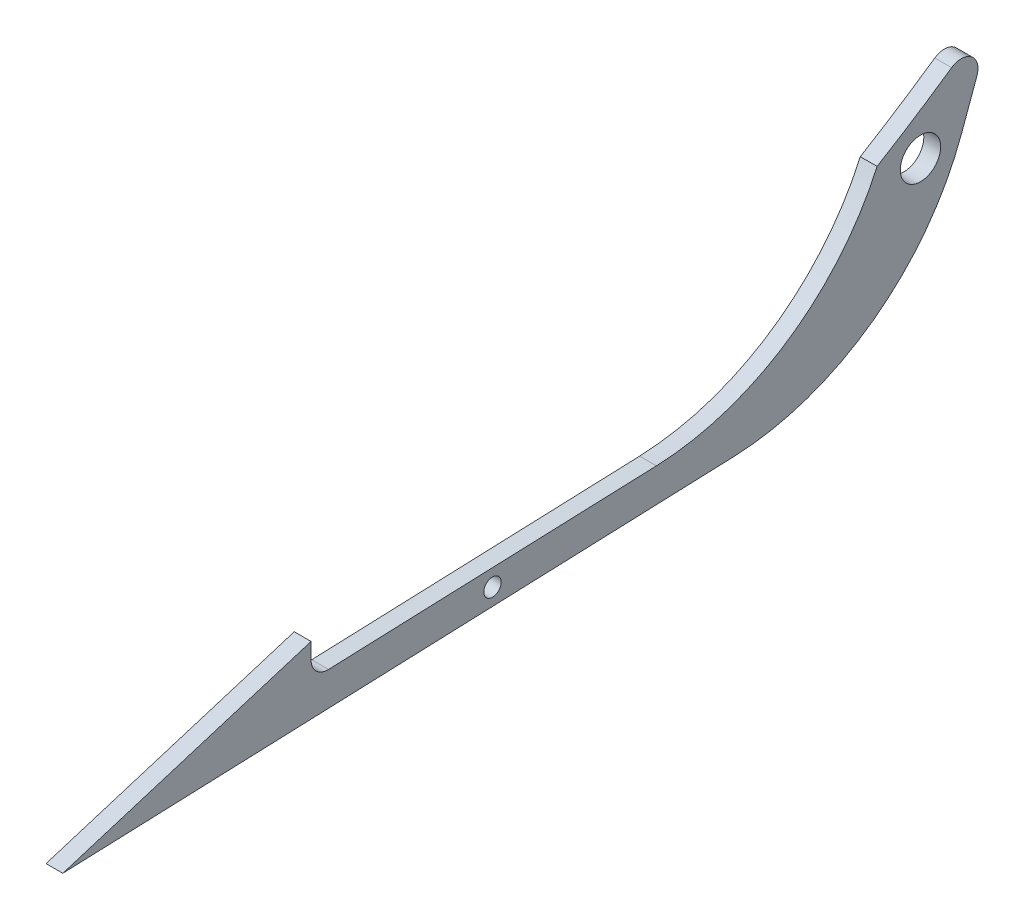
ISO-10303-21;
HEADER;
FILE_DESCRIPTION(('STEP AP214'),'2;1');
FILE_NAME('part.step','',(''),(''),'','','');
FILE_SCHEMA(('AUTOMOTIVE_DESIGN { 1 0 10303 214 1 1 1 1 }'));
ENDSEC;
DATA;
#1=APPLICATION_CONTEXT('core data for automotive mechanical design processes');
#2=APPLICATION_PROTOCOL_DEFINITION('international standard','automotive_design',2000,#1);
#3=PRODUCT_CONTEXT('',#1,'mechanical');
#4=PRODUCT('Part','Part','',(#3));
#5=PRODUCT_RELATED_PRODUCT_CATEGORY('part','',(#4));
#6=PRODUCT_DEFINITION_FORMATION('','',#4);
#7=PRODUCT_DEFINITION_CONTEXT('part definition',#1,'design');
#8=PRODUCT_DEFINITION('design','',#6,#7);
#9=PRODUCT_DEFINITION_SHAPE('','',#8);
#10=(LENGTH_UNIT() NAMED_UNIT(*) SI_UNIT(.MILLI.,.METRE.));
#11=(NAMED_UNIT(*) PLANE_ANGLE_UNIT() SI_UNIT($,.RADIAN.));
#12=(NAMED_UNIT(*) SI_UNIT($,.STERADIAN.) SOLID_ANGLE_UNIT());
#13=UNCERTAINTY_MEASURE_WITH_UNIT(LENGTH_MEASURE(1.E-05),#10,'distance_accuracy_value','');
#14=(GEOMETRIC_REPRESENTATION_CONTEXT(3) GLOBAL_UNCERTAINTY_ASSIGNED_CONTEXT((#13)) GLOBAL_UNIT_ASSIGNED_CONTEXT((#10,
#11,#12)) REPRESENTATION_CONTEXT('',''));
#15=CARTESIAN_POINT('',(0.,0.,0.));
#16=DIRECTION('',(0.,0.,1.));
#17=DIRECTION('',(1.,0.,0.));
#18=AXIS2_PLACEMENT_3D('',#15,#16,#17);
#19=CARTESIAN_POINT('',(5.,398.214009515141,128.31247679814));
#20=DIRECTION('',(-1.,0.,0.));
#21=DIRECTION('',(0.,0.,1.));
#22=AXIS2_PLACEMENT_3D('',#19,#20,#21);
#23=PLANE('',#22);
#24=CARTESIAN_POINT('',(5.,-16.0527869242775,23.4027223186596));
#25=DIRECTION('',(1.,0.,0.));
#26=DIRECTION('',(0.,0.,-1.));
#27=AXIS2_PLACEMENT_3D('',#24,#25,#26);
#28=CIRCLE('',#27,2.6);
#29=CARTESIAN_POINT('',(5.,-16.0527869242775,20.8027223186596));
#30=VERTEX_POINT('',#29);
#31=EDGE_CURVE('E223',#30,#30,#28,.T.);
#32=ORIENTED_EDGE('',*,*,#31,.F.);
#33=EDGE_LOOP('',(#32));
#34=FACE_BOUND('',#33,.T.);
#35=DIRECTION('',(0.,0.939692620785913,-0.342020143325656));
#36=VECTOR('',#35,1.);
#37=CARTESIAN_POINT('',(5.,58.8862843819353,-126.237664014152));
#38=LINE('',#37,#36);
#39=CARTESIAN_POINT('',(5.,30.9525220167372,-116.070605982155));
#40=VERTEX_POINT('',#39);
#41=CARTESIAN_POINT('',(5.,43.6222695731689,-120.682016968363));
#42=VERTEX_POINT('',#41);
#43=EDGE_CURVE('E133',#40,#42,#38,.T.);
#44=ORIENTED_EDGE('',*,*,#43,.T.);
#45=CARTESIAN_POINT('',(5.,45.3323702897972,-115.983553864433));
#46=DIRECTION('',(-1.,0.,0.));
#47=DIRECTION('',(0.,0.,1.));
#48=AXIS2_PLACEMENT_3D('',#45,#46,#47);
#49=CIRCLE('',#48,5.);
#50=CARTESIAN_POINT('',(5.,49.4433674640736,-113.137556283076));
#51=VERTEX_POINT('',#50);
#52=EDGE_CURVE('E11',#42,#51,#49,.F.);
#53=ORIENTED_EDGE('',*,*,#52,.T.);
#54=CARTESIAN_POINT('',(5.,398.214009515141,128.31247679814));
#55=DIRECTION('',(-1.,0.,0.));
#56=DIRECTION('',(0.,0.,1.));
#57=AXIS2_PLACEMENT_3D('',#54,#55,#56);
#58=CIRCLE('',#57,424.192266822056);
#59=CARTESIAN_POINT('',(5.,35.1000318015456,-90.9757317782553));
#60=VERTEX_POINT('',#59);
#61=EDGE_CURVE('E191',#51,#60,#58,.T.);
#62=ORIENTED_EDGE('',*,*,#61,.T.);
#63=CARTESIAN_POINT('',(5.,65.739369291292,-22.5196801963139));
#64=DIRECTION('',(-1.,0.,0.));
#65=DIRECTION('',(0.,0.,1.));
#66=AXIS2_PLACEMENT_3D('',#63,#64,#65);
#67=CIRCLE('',#66,75.);
#68=CARTESIAN_POINT('',(5.,-9.20715532038069,-25.351366731215));
#69=VERTEX_POINT('',#68);
#70=EDGE_CURVE('E180',#60,#69,#67,.T.);
#71=ORIENTED_EDGE('',*,*,#70,.T.);
#72=DIRECTION('',(0.,-0.0377558204653474,0.999286994822303));
#73=VECTOR('',#72,1.);
#74=CARTESIAN_POINT('',(5.,-13.0873297833222,77.345590470861));
#75=LINE('',#74,#73);
#76=CARTESIAN_POINT('',(5.,-12.8912833890062,72.1568113685343));
#77=VERTEX_POINT('',#76);
#78=EDGE_CURVE('E205',#69,#77,#75,.T.);
#79=ORIENTED_EDGE('',*,*,#78,.T.);
#80=CARTESIAN_POINT('',(5.,-7.89484841489466,72.345590470861));
#81=DIRECTION('',(-1.,0.,0.));
#82=DIRECTION('',(0.,0.,1.));
#83=AXIS2_PLACEMENT_3D('',#80,#81,#82);
#84=CIRCLE('',#83,5.);
#85=CARTESIAN_POINT('',(5.,-7.89484841489466,77.345590470861));
#86=VERTEX_POINT('',#85);
#87=EDGE_CURVE('E164',#77,#86,#84,.T.);
#88=ORIENTED_EDGE('',*,*,#87,.T.);
#89=DIRECTION('',(0.,1.,0.));
#90=VECTOR('',#89,1.);
#91=CARTESIAN_POINT('',(5.,-3.08019464415404,77.345590470861));
#92=LINE('',#91,#90);
#93=CARTESIAN_POINT('',(5.,-3.08019464415404,77.345590470861));
#94=VERTEX_POINT('',#93);
#95=EDGE_CURVE('E139',#86,#94,#92,.T.);
#96=ORIENTED_EDGE('',*,*,#95,.T.);
#97=DIRECTION('',(0.,-0.295103827863489,0.955465190773749));
#98=VECTOR('',#97,1.);
#99=CARTESIAN_POINT('',(5.,-25.8840673457626,151.178270781947));
#100=LINE('',#99,#98);
#101=CARTESIAN_POINT('',(5.,-25.8840673457626,151.178270781947));
#102=VERTEX_POINT('',#101);
#103=EDGE_CURVE('E134',#94,#102,#100,.T.);
#104=ORIENTED_EDGE('',*,*,#103,.T.);
#105=DIRECTION('',(0.,0.0377558204653473,-0.999286994822302));
#106=VECTOR('',#105,1.);
#107=CARTESIAN_POINT('',(5.,-25.8840673457626,151.178270781947));
#108=LINE('',#107,#106);
#109=CARTESIAN_POINT('',(5.,-18.3424918455112,-48.4253459581126));
#110=VERTEX_POINT('',#109);
#111=EDGE_CURVE('E122',#102,#110,#108,.T.);
#112=ORIENTED_EDGE('',*,*,#111,.T.);
#113=CARTESIAN_POINT('',(5.,56.6040327661615,-45.5936594232115));
#114=DIRECTION('',(-1.,0.,0.));
#115=DIRECTION('',(0.,0.,1.));
#116=AXIS2_PLACEMENT_3D('',#113,#114,#115);
#117=CIRCLE('',#116,75.);
#118=EDGE_CURVE('E172',#110,#40,#117,.F.);
#119=ORIENTED_EDGE('',*,*,#118,.T.);
#120=EDGE_LOOP('',(#44,#53,#62,#71,#79,#88,#96,#104,#112,#119));
#121=FACE_BOUND('',#120,.T.);
#122=CARTESIAN_POINT('',(5.,30.6985153652574,-103.870185422396));
#123=DIRECTION('',(1.,0.,0.));
#124=DIRECTION('',(0.,0.,-1.));
#125=AXIS2_PLACEMENT_3D('',#122,#123,#124);
#126=CIRCLE('',#125,5.99999999999999);
#127=CARTESIAN_POINT('',(5.,30.6985153652574,-109.870185422396));
#128=VERTEX_POINT('',#127);
#129=EDGE_CURVE('E210',#128,#128,#126,.T.);
#130=ORIENTED_EDGE('',*,*,#129,.F.);
#131=EDGE_LOOP('',(#130));
#132=FACE_BOUND('',#131,.T.);
#133=ADVANCED_FACE('F45',(#34,#121,#132),#23,.F.);
#134=CARTESIAN_POINT('',(0.,398.214009515141,128.31247679814));
#135=DIRECTION('',(-1.,0.,0.));
#136=DIRECTION('',(0.,0.,1.));
#137=AXIS2_PLACEMENT_3D('',#134,#135,#136);
#138=PLANE('',#137);
#139=CARTESIAN_POINT('',(0.,-16.0527869242775,23.4027223186596));
#140=DIRECTION('',(1.,0.,0.));
#141=DIRECTION('',(0.,0.,-1.));
#142=AXIS2_PLACEMENT_3D('',#139,#140,#141);
#143=CIRCLE('',#142,2.6);
#144=CARTESIAN_POINT('',(0.,-16.0527869242775,20.8027223186596));
#145=VERTEX_POINT('',#144);
#146=EDGE_CURVE('E220',#145,#145,#143,.T.);
#147=ORIENTED_EDGE('',*,*,#146,.T.);
#148=EDGE_LOOP('',(#147));
#149=FACE_BOUND('',#148,.T.);
#150=CARTESIAN_POINT('',(0.,398.214009515141,128.31247679814));
#151=DIRECTION('',(-1.,0.,0.));
#152=DIRECTION('',(0.,0.,1.));
#153=AXIS2_PLACEMENT_3D('',#150,#151,#152);
#154=CIRCLE('',#153,424.192266822056);
#155=CARTESIAN_POINT('',(0.,49.4433674640736,-113.137556283076));
#156=VERTEX_POINT('',#155);
#157=CARTESIAN_POINT('',(0.,35.1000318015456,-90.9757317782553));
#158=VERTEX_POINT('',#157);
#159=EDGE_CURVE('E190',#156,#158,#154,.T.);
#160=ORIENTED_EDGE('',*,*,#159,.F.);
#161=CARTESIAN_POINT('',(0.,45.3323702897972,-115.983553864433));
#162=DIRECTION('',(-1.,0.,0.));
#163=DIRECTION('',(0.,0.,1.));
#164=AXIS2_PLACEMENT_3D('',#161,#162,#163);
#165=CIRCLE('',#164,5.);
#166=CARTESIAN_POINT('',(0.,43.6222695731689,-120.682016968363));
#167=VERTEX_POINT('',#166);
#168=EDGE_CURVE('E67',#156,#167,#165,.T.);
#169=ORIENTED_EDGE('',*,*,#168,.T.);
#170=DIRECTION('',(0.,0.939692620785913,-0.342020143325656));
#171=VECTOR('',#170,1.);
#172=CARTESIAN_POINT('',(0.,58.8862843819353,-126.237664014152));
#173=LINE('',#172,#171);
#174=CARTESIAN_POINT('',(0.,30.9525220167372,-116.070605982155));
#175=VERTEX_POINT('',#174);
#176=EDGE_CURVE('E198',#175,#167,#173,.T.);
#177=ORIENTED_EDGE('',*,*,#176,.F.);
#178=CARTESIAN_POINT('',(0.,56.6040327661615,-45.5936594232115));
#179=DIRECTION('',(-1.,0.,0.));
#180=DIRECTION('',(0.,0.,1.));
#181=AXIS2_PLACEMENT_3D('',#178,#179,#180);
#182=CIRCLE('',#181,75.);
#183=CARTESIAN_POINT('',(0.,-18.3424918455112,-48.4253459581126));
#184=VERTEX_POINT('',#183);
#185=EDGE_CURVE('E169',#175,#184,#182,.T.);
#186=ORIENTED_EDGE('',*,*,#185,.T.);
#187=DIRECTION('',(0.,0.0377558204653473,-0.999286994822302));
#188=VECTOR('',#187,1.);
#189=CARTESIAN_POINT('',(0.,-25.8840673457626,151.178270781947));
#190=LINE('',#189,#188);
#191=CARTESIAN_POINT('',(0.,-25.8840673457626,151.178270781947));
#192=VERTEX_POINT('',#191);
#193=EDGE_CURVE('E201',#192,#184,#190,.T.);
#194=ORIENTED_EDGE('',*,*,#193,.F.);
#195=DIRECTION('',(0.,-0.295103827863489,0.955465190773749));
#196=VECTOR('',#195,1.);
#197=CARTESIAN_POINT('',(0.,-25.8840673457626,151.178270781947));
#198=LINE('',#197,#196);
#199=CARTESIAN_POINT('',(0.,-3.08019464415404,77.345590470861));
#200=VERTEX_POINT('',#199);
#201=EDGE_CURVE('E147',#200,#192,#198,.T.);
#202=ORIENTED_EDGE('',*,*,#201,.F.);
#203=DIRECTION('',(0.,1.,0.));
#204=VECTOR('',#203,1.);
#205=CARTESIAN_POINT('',(0.,-3.08019464415404,77.345590470861));
#206=LINE('',#205,#204);
#207=CARTESIAN_POINT('',(0.,-7.89484841489466,77.345590470861));
#208=VERTEX_POINT('',#207);
#209=EDGE_CURVE('E143',#208,#200,#206,.T.);
#210=ORIENTED_EDGE('',*,*,#209,.F.);
#211=CARTESIAN_POINT('',(0.,-7.89484841489466,72.345590470861));
#212=DIRECTION('',(-1.,0.,0.));
#213=DIRECTION('',(0.,0.,1.));
#214=AXIS2_PLACEMENT_3D('',#211,#212,#213);
#215=CIRCLE('',#214,5.);
#216=CARTESIAN_POINT('',(0.,-12.8912833890062,72.1568113685343));
#217=VERTEX_POINT('',#216);
#218=EDGE_CURVE('E161',#208,#217,#215,.F.);
#219=ORIENTED_EDGE('',*,*,#218,.T.);
#220=DIRECTION('',(0.,-0.0377558204653474,0.999286994822303));
#221=VECTOR('',#220,1.);
#222=CARTESIAN_POINT('',(0.,-13.0873297833222,77.345590470861));
#223=LINE('',#222,#221);
#224=CARTESIAN_POINT('',(0.,-9.20715532038069,-25.351366731215));
#225=VERTEX_POINT('',#224);
#226=EDGE_CURVE('E197',#225,#217,#223,.T.);
#227=ORIENTED_EDGE('',*,*,#226,.F.);
#228=CARTESIAN_POINT('',(0.,65.739369291292,-22.5196801963139));
#229=DIRECTION('',(-1.,0.,0.));
#230=DIRECTION('',(0.,0.,1.));
#231=AXIS2_PLACEMENT_3D('',#228,#229,#230);
#232=CIRCLE('',#231,75.);
#233=EDGE_CURVE('E177',#225,#158,#232,.F.);
#234=ORIENTED_EDGE('',*,*,#233,.T.);
#235=EDGE_LOOP('',(#160,#169,#177,#186,#194,#202,#210,#219,#227,#234));
#236=FACE_BOUND('',#235,.T.);
#237=CARTESIAN_POINT('',(0.,30.6985153652574,-103.870185422396));
#238=DIRECTION('',(1.,0.,0.));
#239=DIRECTION('',(0.,0.,-1.));
#240=AXIS2_PLACEMENT_3D('',#237,#238,#239);
#241=CIRCLE('',#240,5.99999999999999);
#242=CARTESIAN_POINT('',(0.,30.6985153652574,-109.870185422396));
#243=VERTEX_POINT('',#242);
#244=EDGE_CURVE('E217',#243,#243,#241,.T.);
#245=ORIENTED_EDGE('',*,*,#244,.T.);
#246=EDGE_LOOP('',(#245));
#247=FACE_BOUND('',#246,.T.);
#248=ADVANCED_FACE('F194',(#149,#236,#247),#138,.T.);
#249=CARTESIAN_POINT('',(5.,-25.8840673457626,151.178270781947));
#250=DIRECTION('',(0.,-0.955465190773749,-0.295103827863489));
#251=DIRECTION('',(0.,0.295103827863489,-0.955465190773749));
#252=AXIS2_PLACEMENT_3D('',#249,#250,#251);
#253=PLANE('',#252);
#254=ORIENTED_EDGE('',*,*,#201,.T.);
#255=DIRECTION('',(-1.,0.,0.));
#256=VECTOR('',#255,1.);
#257=CARTESIAN_POINT('',(5.,-25.8840673457626,151.178270781947));
#258=LINE('',#257,#256);
#259=EDGE_CURVE('E127',#102,#192,#258,.T.);
#260=ORIENTED_EDGE('',*,*,#259,.F.);
#261=ORIENTED_EDGE('',*,*,#103,.F.);
#262=DIRECTION('',(-1.,0.,0.));
#263=VECTOR('',#262,1.);
#264=CARTESIAN_POINT('',(5.,-3.08019464415404,77.345590470861));
#265=LINE('',#264,#263);
#266=EDGE_CURVE('E155',#94,#200,#265,.T.);
#267=ORIENTED_EDGE('',*,*,#266,.T.);
#268=EDGE_LOOP('',(#254,#260,#261,#267));
#269=FACE_BOUND('',#268,.T.);
#270=ADVANCED_FACE('F145',(#269),#253,.F.);
#271=CARTESIAN_POINT('',(5.,-25.8840673457626,151.178270781947));
#272=DIRECTION('',(0.,0.999286994822303,0.0377558204653473));
#273=DIRECTION('',(0.,-0.0377558204653473,0.999286994822303));
#274=AXIS2_PLACEMENT_3D('',#271,#272,#273);
#275=PLANE('',#274);
#276=ORIENTED_EDGE('',*,*,#193,.T.);
#277=DIRECTION('',(-1.,0.,0.));
#278=VECTOR('',#277,1.);
#279=CARTESIAN_POINT('',(5.,-18.3424918455112,-48.4253459581126));
#280=LINE('',#279,#278);
#281=EDGE_CURVE('E130',#184,#110,#280,.F.);
#282=ORIENTED_EDGE('',*,*,#281,.T.);
#283=ORIENTED_EDGE('',*,*,#111,.F.);
#284=ORIENTED_EDGE('',*,*,#259,.T.);
#285=EDGE_LOOP('',(#276,#282,#283,#284));
#286=FACE_BOUND('',#285,.T.);
#287=ADVANCED_FACE('F125',(#286),#275,.F.);
#288=CARTESIAN_POINT('',(5.,58.8862843819353,-126.237664014152));
#289=DIRECTION('',(0.,0.342020143325656,0.939692620785913));
#290=DIRECTION('',(0.,-0.939692620785913,0.342020143325656));
#291=AXIS2_PLACEMENT_3D('',#288,#289,#290);
#292=PLANE('',#291);
#293=ORIENTED_EDGE('',*,*,#176,.T.);
#294=DIRECTION('',(-1.,0.,0.));
#295=VECTOR('',#294,1.);
#296=CARTESIAN_POINT('',(5.,43.6222695731689,-120.682016968363));
#297=LINE('',#296,#295);
#298=EDGE_CURVE('E53',#167,#42,#297,.F.);
#299=ORIENTED_EDGE('',*,*,#298,.T.);
#300=ORIENTED_EDGE('',*,*,#43,.F.);
#301=DIRECTION('',(-1.,0.,0.));
#302=VECTOR('',#301,1.);
#303=CARTESIAN_POINT('',(5.,30.9525220167372,-116.070605982155));
#304=LINE('',#303,#302);
#305=EDGE_CURVE('E166',#40,#175,#304,.T.);
#306=ORIENTED_EDGE('',*,*,#305,.T.);
#307=EDGE_LOOP('',(#293,#299,#300,#306));
#308=FACE_BOUND('',#307,.T.);
#309=ADVANCED_FACE('F214',(#308),#292,.F.);
#310=CARTESIAN_POINT('',(5.,398.214009515141,128.31247679814));
#311=DIRECTION('',(-1.,0.,0.));
#312=DIRECTION('',(0.,0.,1.));
#313=AXIS2_PLACEMENT_3D('',#310,#311,#312);
#314=CYLINDRICAL_SURFACE('',#313,424.192266822056);
#315=ORIENTED_EDGE('',*,*,#61,.F.);
#316=DIRECTION('',(-1.,0.,0.));
#317=VECTOR('',#316,1.);
#318=CARTESIAN_POINT('',(5.,49.4433674640735,-113.137556283076));
#319=LINE('',#318,#317);
#320=EDGE_CURVE('E182',#51,#156,#319,.T.);
#321=ORIENTED_EDGE('',*,*,#320,.T.);
#322=ORIENTED_EDGE('',*,*,#159,.T.);
#323=DIRECTION('',(-1.,0.,0.));
#324=VECTOR('',#323,1.);
#325=CARTESIAN_POINT('',(5.,35.1000318015456,-90.9757317782553));
#326=LINE('',#325,#324);
#327=EDGE_CURVE('E149',#60,#158,#326,.T.);
#328=ORIENTED_EDGE('',*,*,#327,.F.);
#329=EDGE_LOOP('',(#315,#321,#322,#328));
#330=FACE_BOUND('',#329,.T.);
#331=ADVANCED_FACE('F188',(#330),#314,.F.);
#332=CARTESIAN_POINT('',(5.,-13.0873297833222,77.345590470861));
#333=DIRECTION('',(0.,-0.999286994822303,-0.0377558204653474));
#334=DIRECTION('',(0.,0.0377558204653474,-0.999286994822303));
#335=AXIS2_PLACEMENT_3D('',#332,#333,#334);
#336=PLANE('',#335);
#337=ORIENTED_EDGE('',*,*,#78,.F.);
#338=DIRECTION('',(-1.,0.,0.));
#339=VECTOR('',#338,1.);
#340=CARTESIAN_POINT('',(5.,-9.20715532038069,-25.351366731215));
#341=LINE('',#340,#339);
#342=EDGE_CURVE('E174',#69,#225,#341,.T.);
#343=ORIENTED_EDGE('',*,*,#342,.T.);
#344=ORIENTED_EDGE('',*,*,#226,.T.);
#345=DIRECTION('',(-1.,0.,0.));
#346=VECTOR('',#345,1.);
#347=CARTESIAN_POINT('',(5.,-12.8912833890062,72.1568113685343));
#348=LINE('',#347,#346);
#349=EDGE_CURVE('E152',#217,#77,#348,.F.);
#350=ORIENTED_EDGE('',*,*,#349,.T.);
#351=EDGE_LOOP('',(#337,#343,#344,#350));
#352=FACE_BOUND('',#351,.T.);
#353=ADVANCED_FACE('F249',(#352),#336,.F.);
#354=CARTESIAN_POINT('',(5.,-3.08019464415404,77.345590470861));
#355=DIRECTION('',(0.,0.,1.));
#356=DIRECTION('',(1.,0.,0.));
#357=AXIS2_PLACEMENT_3D('',#354,#355,#356);
#358=PLANE('',#357);
#359=ORIENTED_EDGE('',*,*,#95,.F.);
#360=DIRECTION('',(-1.,0.,0.));
#361=VECTOR('',#360,1.);
#362=CARTESIAN_POINT('',(0.,-7.89484841489466,77.345590470861));
#363=LINE('',#362,#361);
#364=EDGE_CURVE('E148',#86,#208,#363,.T.);
#365=ORIENTED_EDGE('',*,*,#364,.T.);
#366=ORIENTED_EDGE('',*,*,#209,.T.);
#367=ORIENTED_EDGE('',*,*,#266,.F.);
#368=EDGE_LOOP('',(#359,#365,#366,#367));
#369=FACE_BOUND('',#368,.T.);
#370=ADVANCED_FACE('F246',(#369),#358,.F.);
#371=CARTESIAN_POINT('',(5.,30.6985153652574,-103.870185422396));
#372=DIRECTION('',(-1.,0.,0.));
#373=DIRECTION('',(0.,0.,1.));
#374=AXIS2_PLACEMENT_3D('',#371,#372,#373);
#375=CYLINDRICAL_SURFACE('',#374,5.99999999999999);
#376=ORIENTED_EDGE('',*,*,#129,.T.);
#377=EDGE_LOOP('',(#376));
#378=FACE_BOUND('',#377,.T.);
#379=ORIENTED_EDGE('',*,*,#244,.F.);
#380=EDGE_LOOP('',(#379));
#381=FACE_BOUND('',#380,.T.);
#382=ADVANCED_FACE('F244',(#378,#381),#375,.F.);
#383=CARTESIAN_POINT('',(5.,-7.89484841489466,72.345590470861));
#384=DIRECTION('',(1.,0.,0.));
#385=DIRECTION('',(0.,0.,-1.));
#386=AXIS2_PLACEMENT_3D('',#383,#384,#385);
#387=CYLINDRICAL_SURFACE('',#386,5.);
#388=ORIENTED_EDGE('',*,*,#87,.F.);
#389=ORIENTED_EDGE('',*,*,#349,.F.);
#390=ORIENTED_EDGE('',*,*,#218,.F.);
#391=ORIENTED_EDGE('',*,*,#364,.F.);
#392=EDGE_LOOP('',(#388,#389,#390,#391));
#393=FACE_BOUND('',#392,.T.);
#394=ADVANCED_FACE('F262',(#393),#387,.F.);
#395=CARTESIAN_POINT('',(5.,56.6040327661615,-45.5936594232115));
#396=DIRECTION('',(-1.,0.,0.));
#397=DIRECTION('',(0.,0.,1.));
#398=AXIS2_PLACEMENT_3D('',#395,#396,#397);
#399=CYLINDRICAL_SURFACE('',#398,75.);
#400=ORIENTED_EDGE('',*,*,#118,.F.);
#401=ORIENTED_EDGE('',*,*,#281,.F.);
#402=ORIENTED_EDGE('',*,*,#185,.F.);
#403=ORIENTED_EDGE('',*,*,#305,.F.);
#404=EDGE_LOOP('',(#400,#401,#402,#403));
#405=FACE_BOUND('',#404,.T.);
#406=ADVANCED_FACE('F212',(#405),#399,.T.);
#407=CARTESIAN_POINT('',(5.,65.739369291292,-22.5196801963139));
#408=DIRECTION('',(-1.,0.,0.));
#409=DIRECTION('',(0.,0.,1.));
#410=AXIS2_PLACEMENT_3D('',#407,#408,#409);
#411=CYLINDRICAL_SURFACE('',#410,75.);
#412=ORIENTED_EDGE('',*,*,#70,.F.);
#413=ORIENTED_EDGE('',*,*,#327,.T.);
#414=ORIENTED_EDGE('',*,*,#233,.F.);
#415=ORIENTED_EDGE('',*,*,#342,.F.);
#416=EDGE_LOOP('',(#412,#413,#414,#415));
#417=FACE_BOUND('',#416,.T.);
#418=ADVANCED_FACE('F267',(#417),#411,.F.);
#419=CARTESIAN_POINT('',(5.,45.3323702897972,-115.983553864433));
#420=DIRECTION('',(-1.,0.,0.));
#421=DIRECTION('',(0.,0.,1.));
#422=AXIS2_PLACEMENT_3D('',#419,#420,#421);
#423=CYLINDRICAL_SURFACE('',#422,5.);
#424=ORIENTED_EDGE('',*,*,#52,.F.);
#425=ORIENTED_EDGE('',*,*,#298,.F.);
#426=ORIENTED_EDGE('',*,*,#168,.F.);
#427=ORIENTED_EDGE('',*,*,#320,.F.);
#428=EDGE_LOOP('',(#424,#425,#426,#427));
#429=FACE_BOUND('',#428,.T.);
#430=ADVANCED_FACE('F47',(#429),#423,.T.);
#431=CARTESIAN_POINT('',(0.,-16.0527869242775,23.4027223186596));
#432=DIRECTION('',(1.,0.,0.));
#433=DIRECTION('',(0.,0.,-1.));
#434=AXIS2_PLACEMENT_3D('',#431,#432,#433);
#435=CYLINDRICAL_SURFACE('',#434,2.6);
#436=ORIENTED_EDGE('',*,*,#146,.F.);
#437=EDGE_LOOP('',(#436));
#438=FACE_BOUND('',#437,.T.);
#439=ORIENTED_EDGE('',*,*,#31,.T.);
#440=EDGE_LOOP('',(#439));
#441=FACE_BOUND('',#440,.T.);
#442=ADVANCED_FACE('F230',(#438,#441),#435,.F.);
#443=CLOSED_SHELL('',(#133,#248,#270,#287,#309,#331,#353,#370,#382,#394,#406,#418,#430,#442));
#444=MANIFOLD_SOLID_BREP('B2',#443);
#445=ADVANCED_BREP_SHAPE_REPRESENTATION('',(#18,#444),#14);
#446=SHAPE_DEFINITION_REPRESENTATION(#9,#445);
ENDSEC;
END-ISO-10303-21;
